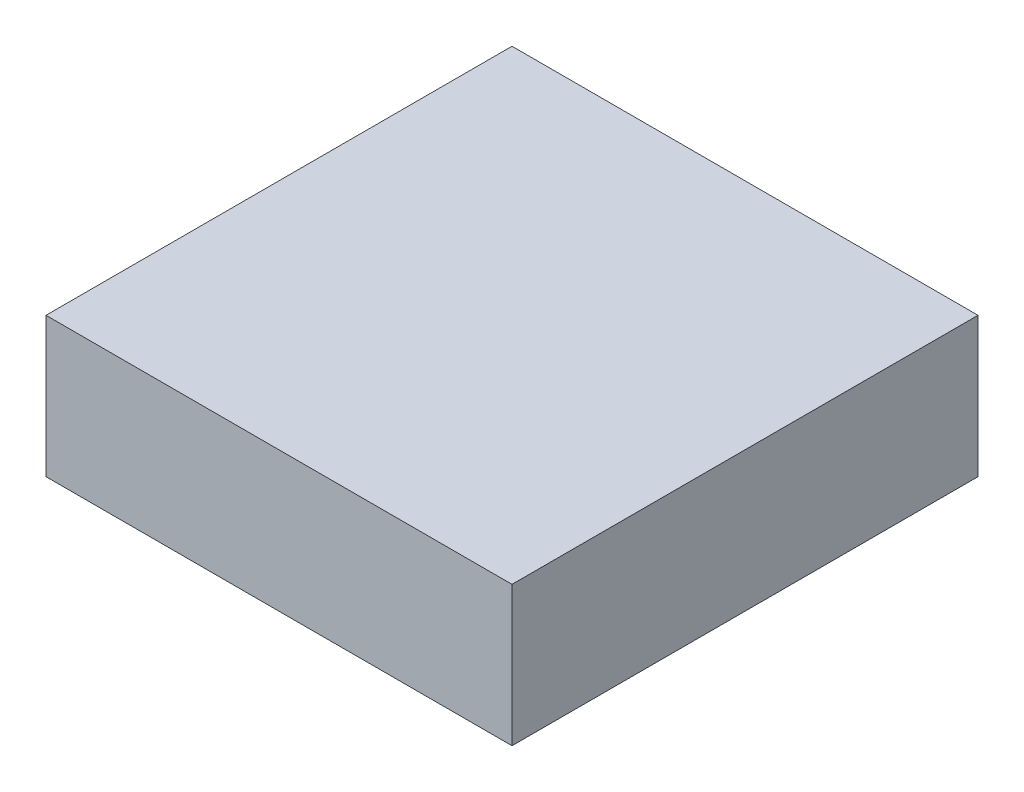
ISO-10303-21;
HEADER;
FILE_DESCRIPTION(('STEP AP214'),'2;1');
FILE_NAME('part.step','',(''),(''),'','','');
FILE_SCHEMA(('AUTOMOTIVE_DESIGN { 1 0 10303 214 1 1 1 1 }'));
ENDSEC;
DATA;
#1=APPLICATION_CONTEXT('core data for automotive mechanical design processes');
#2=APPLICATION_PROTOCOL_DEFINITION('international standard','automotive_design',2000,#1);
#3=PRODUCT_CONTEXT('',#1,'mechanical');
#4=PRODUCT('Part','Part','',(#3));
#5=PRODUCT_RELATED_PRODUCT_CATEGORY('part','',(#4));
#6=PRODUCT_DEFINITION_FORMATION('','',#4);
#7=PRODUCT_DEFINITION_CONTEXT('part definition',#1,'design');
#8=PRODUCT_DEFINITION('design','',#6,#7);
#9=PRODUCT_DEFINITION_SHAPE('','',#8);
#10=(LENGTH_UNIT() NAMED_UNIT(*) SI_UNIT(.MILLI.,.METRE.));
#11=(NAMED_UNIT(*) PLANE_ANGLE_UNIT() SI_UNIT($,.RADIAN.));
#12=(NAMED_UNIT(*) SI_UNIT($,.STERADIAN.) SOLID_ANGLE_UNIT());
#13=UNCERTAINTY_MEASURE_WITH_UNIT(LENGTH_MEASURE(1.E-05),#10,'distance_accuracy_value','');
#14=(GEOMETRIC_REPRESENTATION_CONTEXT(3) GLOBAL_UNCERTAINTY_ASSIGNED_CONTEXT((#13)) GLOBAL_UNIT_ASSIGNED_CONTEXT((#10,
#11,#12)) REPRESENTATION_CONTEXT('',''));
#15=CARTESIAN_POINT('',(0.,0.,0.));
#16=DIRECTION('',(0.,0.,1.));
#17=DIRECTION('',(1.,0.,0.));
#18=AXIS2_PLACEMENT_3D('',#15,#16,#17);
#19=CARTESIAN_POINT('',(30.,18.,30.));
#20=DIRECTION('',(-1.,0.,0.));
#21=DIRECTION('',(0.,0.,1.));
#22=AXIS2_PLACEMENT_3D('',#19,#20,#21);
#23=PLANE('',#22);
#24=DIRECTION('',(0.,0.,-1.));
#25=VECTOR('',#24,1.);
#26=CARTESIAN_POINT('',(30.,0.,30.));
#27=LINE('',#26,#25);
#28=CARTESIAN_POINT('',(30.,0.,30.));
#29=VERTEX_POINT('',#28);
#30=CARTESIAN_POINT('',(30.,0.,-30.));
#31=VERTEX_POINT('',#30);
#32=EDGE_CURVE('E98',#29,#31,#27,.T.);
#33=ORIENTED_EDGE('',*,*,#32,.T.);
#34=DIRECTION('',(0.,-1.,0.));
#35=VECTOR('',#34,1.);
#36=CARTESIAN_POINT('',(30.,18.,-30.));
#37=LINE('',#36,#35);
#38=CARTESIAN_POINT('',(30.,18.,-30.));
#39=VERTEX_POINT('',#38);
#40=EDGE_CURVE('E11',#39,#31,#37,.T.);
#41=ORIENTED_EDGE('',*,*,#40,.F.);
#42=DIRECTION('',(0.,0.,-1.));
#43=VECTOR('',#42,1.);
#44=CARTESIAN_POINT('',(30.,18.,30.));
#45=LINE('',#44,#43);
#46=CARTESIAN_POINT('',(30.,18.,30.));
#47=VERTEX_POINT('',#46);
#48=EDGE_CURVE('E86',#47,#39,#45,.T.);
#49=ORIENTED_EDGE('',*,*,#48,.F.);
#50=DIRECTION('',(0.,-1.,0.));
#51=VECTOR('',#50,1.);
#52=CARTESIAN_POINT('',(30.,18.,30.));
#53=LINE('',#52,#51);
#54=EDGE_CURVE('E94',#47,#29,#53,.T.);
#55=ORIENTED_EDGE('',*,*,#54,.T.);
#56=EDGE_LOOP('',(#33,#41,#49,#55));
#57=FACE_BOUND('',#56,.T.);
#58=ADVANCED_FACE('F35',(#57),#23,.F.);
#59=CARTESIAN_POINT('',(-30.,18.,-30.));
#60=DIRECTION('',(0.,0.,1.));
#61=DIRECTION('',(1.,0.,0.));
#62=AXIS2_PLACEMENT_3D('',#59,#60,#61);
#63=PLANE('',#62);
#64=DIRECTION('',(-1.,0.,0.));
#65=VECTOR('',#64,1.);
#66=CARTESIAN_POINT('',(-30.,0.,-30.));
#67=LINE('',#66,#65);
#68=CARTESIAN_POINT('',(-30.,0.,-30.));
#69=VERTEX_POINT('',#68);
#70=EDGE_CURVE('E90',#31,#69,#67,.T.);
#71=ORIENTED_EDGE('',*,*,#70,.T.);
#72=DIRECTION('',(0.,-1.,0.));
#73=VECTOR('',#72,1.);
#74=CARTESIAN_POINT('',(-30.,18.,-30.));
#75=LINE('',#74,#73);
#76=CARTESIAN_POINT('',(-30.,18.,-30.));
#77=VERTEX_POINT('',#76);
#78=EDGE_CURVE('E43',#77,#69,#75,.T.);
#79=ORIENTED_EDGE('',*,*,#78,.F.);
#80=DIRECTION('',(-1.,0.,0.));
#81=VECTOR('',#80,1.);
#82=CARTESIAN_POINT('',(-30.,18.,-30.));
#83=LINE('',#82,#81);
#84=EDGE_CURVE('E81',#39,#77,#83,.T.);
#85=ORIENTED_EDGE('',*,*,#84,.F.);
#86=ORIENTED_EDGE('',*,*,#40,.T.);
#87=EDGE_LOOP('',(#71,#79,#85,#86));
#88=FACE_BOUND('',#87,.T.);
#89=ADVANCED_FACE('F89',(#88),#63,.F.);
#90=CARTESIAN_POINT('',(-30.,18.,30.));
#91=DIRECTION('',(1.,0.,0.));
#92=DIRECTION('',(0.,0.,-1.));
#93=AXIS2_PLACEMENT_3D('',#90,#91,#92);
#94=PLANE('',#93);
#95=DIRECTION('',(0.,0.,1.));
#96=VECTOR('',#95,1.);
#97=CARTESIAN_POINT('',(-30.,0.,30.));
#98=LINE('',#97,#96);
#99=CARTESIAN_POINT('',(-30.,0.,30.));
#100=VERTEX_POINT('',#99);
#101=EDGE_CURVE('E68',#69,#100,#98,.T.);
#102=ORIENTED_EDGE('',*,*,#101,.T.);
#103=DIRECTION('',(0.,-1.,0.));
#104=VECTOR('',#103,1.);
#105=CARTESIAN_POINT('',(-30.,18.,30.));
#106=LINE('',#105,#104);
#107=CARTESIAN_POINT('',(-30.,18.,30.));
#108=VERTEX_POINT('',#107);
#109=EDGE_CURVE('E91',#108,#100,#106,.T.);
#110=ORIENTED_EDGE('',*,*,#109,.F.);
#111=DIRECTION('',(0.,0.,1.));
#112=VECTOR('',#111,1.);
#113=CARTESIAN_POINT('',(-30.,18.,30.));
#114=LINE('',#113,#112);
#115=EDGE_CURVE('E84',#77,#108,#114,.T.);
#116=ORIENTED_EDGE('',*,*,#115,.F.);
#117=ORIENTED_EDGE('',*,*,#78,.T.);
#118=EDGE_LOOP('',(#102,#110,#116,#117));
#119=FACE_BOUND('',#118,.T.);
#120=ADVANCED_FACE('F92',(#119),#94,.F.);
#121=CARTESIAN_POINT('',(-30.,18.,30.));
#122=DIRECTION('',(0.,0.,-1.));
#123=DIRECTION('',(-1.,0.,0.));
#124=AXIS2_PLACEMENT_3D('',#121,#122,#123);
#125=PLANE('',#124);
#126=DIRECTION('',(1.,0.,0.));
#127=VECTOR('',#126,1.);
#128=CARTESIAN_POINT('',(-30.,0.,30.));
#129=LINE('',#128,#127);
#130=EDGE_CURVE('E74',#100,#29,#129,.T.);
#131=ORIENTED_EDGE('',*,*,#130,.T.);
#132=ORIENTED_EDGE('',*,*,#54,.F.);
#133=DIRECTION('',(1.,0.,0.));
#134=VECTOR('',#133,1.);
#135=CARTESIAN_POINT('',(-30.,18.,30.));
#136=LINE('',#135,#134);
#137=EDGE_CURVE('E51',#108,#47,#136,.T.);
#138=ORIENTED_EDGE('',*,*,#137,.F.);
#139=ORIENTED_EDGE('',*,*,#109,.T.);
#140=EDGE_LOOP('',(#131,#132,#138,#139));
#141=FACE_BOUND('',#140,.T.);
#142=ADVANCED_FACE('F105',(#141),#125,.F.);
#143=CARTESIAN_POINT('',(0.,18.,0.));
#144=DIRECTION('',(0.,-1.,0.));
#145=DIRECTION('',(0.,0.,-1.));
#146=AXIS2_PLACEMENT_3D('',#143,#144,#145);
#147=PLANE('',#146);
#148=ORIENTED_EDGE('',*,*,#48,.T.);
#149=ORIENTED_EDGE('',*,*,#84,.T.);
#150=ORIENTED_EDGE('',*,*,#115,.T.);
#151=ORIENTED_EDGE('',*,*,#137,.T.);
#152=EDGE_LOOP('',(#148,#149,#150,#151));
#153=FACE_BOUND('',#152,.T.);
#154=ADVANCED_FACE('F82',(#153),#147,.F.);
#155=CARTESIAN_POINT('',(0.,0.,0.));
#156=DIRECTION('',(0.,-1.,0.));
#157=DIRECTION('',(0.,0.,-1.));
#158=AXIS2_PLACEMENT_3D('',#155,#156,#157);
#159=PLANE('',#158);
#160=ORIENTED_EDGE('',*,*,#32,.F.);
#161=ORIENTED_EDGE('',*,*,#130,.F.);
#162=ORIENTED_EDGE('',*,*,#101,.F.);
#163=ORIENTED_EDGE('',*,*,#70,.F.);
#164=EDGE_LOOP('',(#160,#161,#162,#163));
#165=FACE_BOUND('',#164,.T.);
#166=ADVANCED_FACE('F108',(#165),#159,.T.);
#167=CLOSED_SHELL('',(#58,#89,#120,#142,#154,#166));
#168=MANIFOLD_SOLID_BREP('B2',#167);
#169=ADVANCED_BREP_SHAPE_REPRESENTATION('',(#18,#168),#14);
#170=SHAPE_DEFINITION_REPRESENTATION(#9,#169);
ENDSEC;
END-ISO-10303-21;
